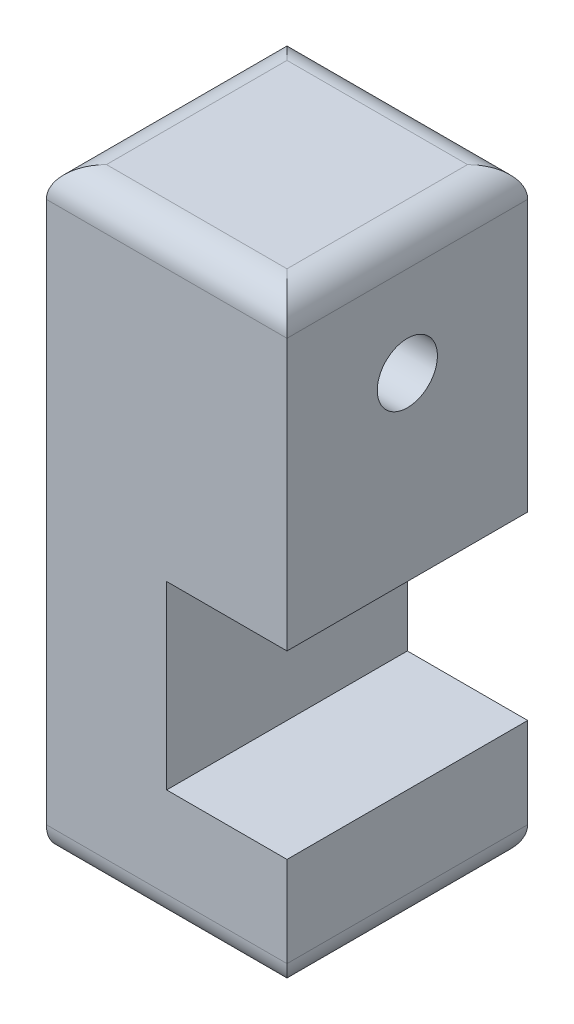
ISO-10303-21;
HEADER;
FILE_DESCRIPTION(('STEP AP214'),'2;1');
FILE_NAME('part.step','',(''),(''),'','','');
FILE_SCHEMA(('AUTOMOTIVE_DESIGN { 1 0 10303 214 1 1 1 1 }'));
ENDSEC;
DATA;
#1=APPLICATION_CONTEXT('core data for automotive mechanical design processes');
#2=APPLICATION_PROTOCOL_DEFINITION('international standard','automotive_design',2000,#1);
#3=PRODUCT_CONTEXT('',#1,'mechanical');
#4=PRODUCT('Part','Part','',(#3));
#5=PRODUCT_RELATED_PRODUCT_CATEGORY('part','',(#4));
#6=PRODUCT_DEFINITION_FORMATION('','',#4);
#7=PRODUCT_DEFINITION_CONTEXT('part definition',#1,'design');
#8=PRODUCT_DEFINITION('design','',#6,#7);
#9=PRODUCT_DEFINITION_SHAPE('','',#8);
#10=(LENGTH_UNIT() NAMED_UNIT(*) SI_UNIT(.MILLI.,.METRE.));
#11=(NAMED_UNIT(*) PLANE_ANGLE_UNIT() SI_UNIT($,.RADIAN.));
#12=(NAMED_UNIT(*) SI_UNIT($,.STERADIAN.) SOLID_ANGLE_UNIT());
#13=UNCERTAINTY_MEASURE_WITH_UNIT(LENGTH_MEASURE(1.E-05),#10,'distance_accuracy_value','');
#14=(GEOMETRIC_REPRESENTATION_CONTEXT(3) GLOBAL_UNCERTAINTY_ASSIGNED_CONTEXT((#13)) GLOBAL_UNIT_ASSIGNED_CONTEXT((#10,
#11,#12)) REPRESENTATION_CONTEXT('',''));
#15=CARTESIAN_POINT('',(0.,0.,0.));
#16=DIRECTION('',(0.,0.,1.));
#17=DIRECTION('',(1.,0.,0.));
#18=AXIS2_PLACEMENT_3D('',#15,#16,#17);
#19=CARTESIAN_POINT('',(25.4,50.8,-12.7));
#20=DIRECTION('',(-1.,0.,0.));
#21=DIRECTION('',(0.,0.,-1.));
#22=AXIS2_PLACEMENT_3D('',#19,#20,#21);
#23=CYLINDRICAL_SURFACE('',#22,3.175);
#24=CARTESIAN_POINT('',(25.4,50.8,-12.7));
#25=DIRECTION('',(-1.,0.,0.));
#26=DIRECTION('',(0.,0.,-1.));
#27=AXIS2_PLACEMENT_3D('',#24,#25,#26);
#28=CIRCLE('',#27,3.175);
#29=CARTESIAN_POINT('',(25.4,50.8,-9.525));
#30=VERTEX_POINT('',#29);
#31=EDGE_CURVE('E26',#30,#30,#28,.T.);
#32=ORIENTED_EDGE('',*,*,#31,.F.);
#33=DIRECTION('',(-1.,0.,0.));
#34=VECTOR('',#33,1.);
#35=CARTESIAN_POINT('',(25.4,50.8,-9.525));
#36=LINE('',#35,#34);
#37=CARTESIAN_POINT('',(0.,50.8,-9.525));
#38=VERTEX_POINT('',#37);
#39=EDGE_CURVE('E10',#30,#38,#36,.T.);
#40=ORIENTED_EDGE('',*,*,#39,.T.);
#41=CARTESIAN_POINT('',(0.,50.8,-12.7));
#42=DIRECTION('',(1.,0.,0.));
#43=DIRECTION('',(0.,0.,-1.));
#44=AXIS2_PLACEMENT_3D('',#41,#42,#43);
#45=CIRCLE('',#44,3.175);
#46=EDGE_CURVE('E233',#38,#38,#45,.T.);
#47=ORIENTED_EDGE('',*,*,#46,.F.);
#48=ORIENTED_EDGE('',*,*,#39,.F.);
#49=EDGE_LOOP('',(#32,#40,#47,#48));
#50=FACE_BOUND('',#49,.T.);
#51=ADVANCED_FACE('F15',(#50),#23,.F.);
#52=CARTESIAN_POINT('',(0.,0.,-25.4));
#53=DIRECTION('',(0.,0.,-1.));
#54=DIRECTION('',(0.,-1.,0.));
#55=AXIS2_PLACEMENT_3D('',#52,#53,#54);
#56=PLANE('',#55);
#57=DIRECTION('',(1.,0.,0.));
#58=VECTOR('',#57,1.);
#59=CARTESIAN_POINT('',(0.,3.175,-25.4));
#60=LINE('',#59,#58);
#61=CARTESIAN_POINT('',(0.,3.175,-25.4));
#62=VERTEX_POINT('',#61);
#63=CARTESIAN_POINT('',(25.4,3.175,-25.4));
#64=VERTEX_POINT('',#63);
#65=EDGE_CURVE('E226',#62,#64,#60,.T.);
#66=ORIENTED_EDGE('',*,*,#65,.F.);
#67=DIRECTION('',(0.,1.,0.));
#68=VECTOR('',#67,1.);
#69=CARTESIAN_POINT('',(0.,0.,-25.4));
#70=LINE('',#69,#68);
#71=CARTESIAN_POINT('',(0.,60.325,-25.4));
#72=VERTEX_POINT('',#71);
#73=EDGE_CURVE('E237',#62,#72,#70,.T.);
#74=ORIENTED_EDGE('',*,*,#73,.T.);
#75=DIRECTION('',(-1.,0.,0.));
#76=VECTOR('',#75,1.);
#77=CARTESIAN_POINT('',(0.,60.325,-25.4));
#78=LINE('',#77,#76);
#79=CARTESIAN_POINT('',(25.4,60.325,-25.4));
#80=VERTEX_POINT('',#79);
#81=EDGE_CURVE('E211',#80,#72,#78,.T.);
#82=ORIENTED_EDGE('',*,*,#81,.F.);
#83=DIRECTION('',(0.,1.,0.));
#84=VECTOR('',#83,1.);
#85=CARTESIAN_POINT('',(25.4,0.,-25.4));
#86=LINE('',#85,#84);
#87=CARTESIAN_POINT('',(25.4,31.75,-25.4));
#88=VERTEX_POINT('',#87);
#89=EDGE_CURVE('E174',#88,#80,#86,.T.);
#90=ORIENTED_EDGE('',*,*,#89,.F.);
#91=DIRECTION('',(-1.,0.,0.));
#92=VECTOR('',#91,1.);
#93=CARTESIAN_POINT('',(12.7,31.75,-25.4));
#94=LINE('',#93,#92);
#95=CARTESIAN_POINT('',(12.7,31.75,-25.4));
#96=VERTEX_POINT('',#95);
#97=EDGE_CURVE('E188',#88,#96,#94,.T.);
#98=ORIENTED_EDGE('',*,*,#97,.T.);
#99=DIRECTION('',(0.,-1.,0.));
#100=VECTOR('',#99,1.);
#101=CARTESIAN_POINT('',(12.7,11.1125,-25.4));
#102=LINE('',#101,#100);
#103=CARTESIAN_POINT('',(12.7,12.7,-25.4));
#104=VERTEX_POINT('',#103);
#105=EDGE_CURVE('E159',#96,#104,#102,.T.);
#106=ORIENTED_EDGE('',*,*,#105,.T.);
#107=DIRECTION('',(1.,0.,0.));
#108=VECTOR('',#107,1.);
#109=CARTESIAN_POINT('',(12.7,12.7,-25.4));
#110=LINE('',#109,#108);
#111=CARTESIAN_POINT('',(25.4,12.7,-25.4));
#112=VERTEX_POINT('',#111);
#113=EDGE_CURVE('E177',#104,#112,#110,.T.);
#114=ORIENTED_EDGE('',*,*,#113,.T.);
#115=DIRECTION('',(0.,1.,0.));
#116=VECTOR('',#115,1.);
#117=CARTESIAN_POINT('',(25.4,0.,-25.4));
#118=LINE('',#117,#116);
#119=EDGE_CURVE('E165',#64,#112,#118,.T.);
#120=ORIENTED_EDGE('',*,*,#119,.F.);
#121=EDGE_LOOP('',(#66,#74,#82,#90,#98,#106,#114,#120));
#122=FACE_BOUND('',#121,.T.);
#123=ADVANCED_FACE('F178',(#122),#56,.T.);
#124=CARTESIAN_POINT('',(25.4,31.75,-12.7));
#125=DIRECTION('',(1.,0.,0.));
#126=DIRECTION('',(0.,1.,0.));
#127=AXIS2_PLACEMENT_3D('',#124,#125,#126);
#128=PLANE('',#127);
#129=ORIENTED_EDGE('',*,*,#31,.T.);
#130=EDGE_LOOP('',(#129));
#131=FACE_BOUND('',#130,.T.);
#132=DIRECTION('',(0.,0.,-1.));
#133=VECTOR('',#132,1.);
#134=CARTESIAN_POINT('',(25.4,60.325,-19.05));
#135=LINE('',#134,#133);
#136=CARTESIAN_POINT('',(25.4,60.325,0.));
#137=VERTEX_POINT('',#136);
#138=EDGE_CURVE('E240',#137,#80,#135,.T.);
#139=ORIENTED_EDGE('',*,*,#138,.F.);
#140=DIRECTION('',(0.,-1.,0.));
#141=VECTOR('',#140,1.);
#142=CARTESIAN_POINT('',(25.4,63.5,0.));
#143=LINE('',#142,#141);
#144=CARTESIAN_POINT('',(25.4,31.75,0.));
#145=VERTEX_POINT('',#144);
#146=EDGE_CURVE('E252',#137,#145,#143,.T.);
#147=ORIENTED_EDGE('',*,*,#146,.T.);
#148=DIRECTION('',(0.,0.,-1.));
#149=VECTOR('',#148,1.);
#150=CARTESIAN_POINT('',(25.4,31.75,-6.35));
#151=LINE('',#150,#149);
#152=EDGE_CURVE('E236',#145,#88,#151,.T.);
#153=ORIENTED_EDGE('',*,*,#152,.T.);
#154=ORIENTED_EDGE('',*,*,#89,.T.);
#155=EDGE_LOOP('',(#139,#147,#153,#154));
#156=FACE_BOUND('',#155,.T.);
#157=ADVANCED_FACE('F360',(#131,#156),#128,.T.);
#158=CARTESIAN_POINT('',(25.4,31.75,-12.7));
#159=DIRECTION('',(1.,0.,0.));
#160=DIRECTION('',(0.,1.,0.));
#161=AXIS2_PLACEMENT_3D('',#158,#159,#160);
#162=PLANE('',#161);
#163=DIRECTION('',(0.,0.,1.));
#164=VECTOR('',#163,1.);
#165=CARTESIAN_POINT('',(25.4,3.175,-6.35));
#166=LINE('',#165,#164);
#167=CARTESIAN_POINT('',(25.4,3.175,0.));
#168=VERTEX_POINT('',#167);
#169=EDGE_CURVE('E169',#64,#168,#166,.T.);
#170=ORIENTED_EDGE('',*,*,#169,.F.);
#171=ORIENTED_EDGE('',*,*,#119,.T.);
#172=DIRECTION('',(0.,0.,1.));
#173=VECTOR('',#172,1.);
#174=CARTESIAN_POINT('',(25.4,12.7,-19.05));
#175=LINE('',#174,#173);
#176=CARTESIAN_POINT('',(25.4,12.7,0.));
#177=VERTEX_POINT('',#176);
#178=EDGE_CURVE('E121',#112,#177,#175,.T.);
#179=ORIENTED_EDGE('',*,*,#178,.T.);
#180=DIRECTION('',(0.,-1.,0.));
#181=VECTOR('',#180,1.);
#182=CARTESIAN_POINT('',(25.4,63.5,0.));
#183=LINE('',#182,#181);
#184=EDGE_CURVE('E247',#177,#168,#183,.T.);
#185=ORIENTED_EDGE('',*,*,#184,.T.);
#186=EDGE_LOOP('',(#170,#171,#179,#185));
#187=FACE_BOUND('',#186,.T.);
#188=ADVANCED_FACE('F167',(#187),#162,.T.);
#189=CARTESIAN_POINT('',(12.7,22.225,-12.7));
#190=DIRECTION('',(-1.,0.,0.));
#191=DIRECTION('',(0.,0.,1.));
#192=AXIS2_PLACEMENT_3D('',#189,#190,#191);
#193=PLANE('',#192);
#194=CARTESIAN_POINT('',(12.7,22.225,-12.7));
#195=DIRECTION('',(-1.,0.,0.));
#196=DIRECTION('',(0.,0.,-1.));
#197=AXIS2_PLACEMENT_3D('',#194,#195,#196);
#198=CIRCLE('',#197,2.0828);
#199=CARTESIAN_POINT('',(12.7,22.225,-10.6172));
#200=VERTEX_POINT('',#199);
#201=EDGE_CURVE('E216',#200,#200,#198,.T.);
#202=ORIENTED_EDGE('',*,*,#201,.T.);
#203=EDGE_LOOP('',(#202));
#204=FACE_BOUND('',#203,.T.);
#205=ORIENTED_EDGE('',*,*,#105,.F.);
#206=DIRECTION('',(0.,0.,-1.));
#207=VECTOR('',#206,1.);
#208=CARTESIAN_POINT('',(12.7,31.75,-25.4));
#209=LINE('',#208,#207);
#210=CARTESIAN_POINT('',(12.7,31.75,0.));
#211=VERTEX_POINT('',#210);
#212=EDGE_CURVE('E194',#211,#96,#209,.T.);
#213=ORIENTED_EDGE('',*,*,#212,.F.);
#214=DIRECTION('',(0.,1.,0.));
#215=VECTOR('',#214,1.);
#216=CARTESIAN_POINT('',(12.7,42.8625,0.));
#217=LINE('',#216,#215);
#218=CARTESIAN_POINT('',(12.7,12.7,0.));
#219=VERTEX_POINT('',#218);
#220=EDGE_CURVE('E253',#219,#211,#217,.T.);
#221=ORIENTED_EDGE('',*,*,#220,.F.);
#222=DIRECTION('',(0.,0.,1.));
#223=VECTOR('',#222,1.);
#224=CARTESIAN_POINT('',(12.7,12.7,0.));
#225=LINE('',#224,#223);
#226=EDGE_CURVE('E181',#104,#219,#225,.T.);
#227=ORIENTED_EDGE('',*,*,#226,.F.);
#228=EDGE_LOOP('',(#205,#213,#221,#227));
#229=FACE_BOUND('',#228,.T.);
#230=ADVANCED_FACE('F380',(#204,#229),#193,.F.);
#231=CARTESIAN_POINT('',(25.4,12.7,-25.4));
#232=DIRECTION('',(0.,-1.,0.));
#233=DIRECTION('',(0.,0.,-1.));
#234=AXIS2_PLACEMENT_3D('',#231,#232,#233);
#235=PLANE('',#234);
#236=ORIENTED_EDGE('',*,*,#178,.F.);
#237=ORIENTED_EDGE('',*,*,#113,.F.);
#238=ORIENTED_EDGE('',*,*,#226,.T.);
#239=DIRECTION('',(-1.,0.,0.));
#240=VECTOR('',#239,1.);
#241=CARTESIAN_POINT('',(12.7,12.7,0.));
#242=LINE('',#241,#240);
#243=EDGE_CURVE('E185',#177,#219,#242,.T.);
#244=ORIENTED_EDGE('',*,*,#243,.F.);
#245=EDGE_LOOP('',(#236,#237,#238,#244));
#246=FACE_BOUND('',#245,.T.);
#247=ADVANCED_FACE('F183',(#246),#235,.F.);
#248=CARTESIAN_POINT('',(25.4,31.75,0.));
#249=DIRECTION('',(0.,1.,0.));
#250=DIRECTION('',(1.,0.,0.));
#251=AXIS2_PLACEMENT_3D('',#248,#249,#250);
#252=PLANE('',#251);
#253=ORIENTED_EDGE('',*,*,#152,.F.);
#254=DIRECTION('',(1.,0.,0.));
#255=VECTOR('',#254,1.);
#256=CARTESIAN_POINT('',(12.7,31.75,0.));
#257=LINE('',#256,#255);
#258=EDGE_CURVE('E248',#211,#145,#257,.T.);
#259=ORIENTED_EDGE('',*,*,#258,.F.);
#260=ORIENTED_EDGE('',*,*,#212,.T.);
#261=ORIENTED_EDGE('',*,*,#97,.F.);
#262=EDGE_LOOP('',(#253,#259,#260,#261));
#263=FACE_BOUND('',#262,.T.);
#264=ADVANCED_FACE('F379',(#263),#252,.F.);
#265=CARTESIAN_POINT('',(0.,63.5,-25.4));
#266=DIRECTION('',(0.,1.,0.));
#267=DIRECTION('',(0.,0.,-1.));
#268=AXIS2_PLACEMENT_3D('',#265,#266,#267);
#269=PLANE('',#268);
#270=DIRECTION('',(0.,0.,-1.));
#271=VECTOR('',#270,1.);
#272=CARTESIAN_POINT('',(3.175,63.5,-19.05));
#273=LINE('',#272,#271);
#274=CARTESIAN_POINT('',(3.175,63.5,-3.175));
#275=VERTEX_POINT('',#274);
#276=CARTESIAN_POINT('',(3.175,63.5,-22.225));
#277=VERTEX_POINT('',#276);
#278=EDGE_CURVE('E204',#275,#277,#273,.T.);
#279=ORIENTED_EDGE('',*,*,#278,.F.);
#280=DIRECTION('',(-1.,0.,0.));
#281=VECTOR('',#280,1.);
#282=CARTESIAN_POINT('',(0.,63.5,-3.175));
#283=LINE('',#282,#281);
#284=CARTESIAN_POINT('',(22.225,63.5,-3.175));
#285=VERTEX_POINT('',#284);
#286=EDGE_CURVE('E241',#285,#275,#283,.T.);
#287=ORIENTED_EDGE('',*,*,#286,.F.);
#288=DIRECTION('',(0.,0.,1.));
#289=VECTOR('',#288,1.);
#290=CARTESIAN_POINT('',(22.225,63.5,-19.05));
#291=LINE('',#290,#289);
#292=CARTESIAN_POINT('',(22.225,63.5,-22.225));
#293=VERTEX_POINT('',#292);
#294=EDGE_CURVE('E145',#293,#285,#291,.T.);
#295=ORIENTED_EDGE('',*,*,#294,.F.);
#296=DIRECTION('',(1.,0.,0.));
#297=VECTOR('',#296,1.);
#298=CARTESIAN_POINT('',(0.,63.5,-22.225));
#299=LINE('',#298,#297);
#300=EDGE_CURVE('E206',#277,#293,#299,.T.);
#301=ORIENTED_EDGE('',*,*,#300,.F.);
#302=EDGE_LOOP('',(#279,#287,#295,#301));
#303=FACE_BOUND('',#302,.T.);
#304=ADVANCED_FACE('F457',(#303),#269,.T.);
#305=CARTESIAN_POINT('',(0.,31.75,-12.7));
#306=DIRECTION('',(1.,0.,0.));
#307=DIRECTION('',(0.,1.,0.));
#308=AXIS2_PLACEMENT_3D('',#305,#306,#307);
#309=PLANE('',#308);
#310=ORIENTED_EDGE('',*,*,#46,.T.);
#311=EDGE_LOOP('',(#310));
#312=FACE_BOUND('',#311,.T.);
#313=CARTESIAN_POINT('',(0.,22.225,-12.7));
#314=DIRECTION('',(1.,0.,0.));
#315=DIRECTION('',(0.,0.,-1.));
#316=AXIS2_PLACEMENT_3D('',#313,#314,#315);
#317=CIRCLE('',#316,2.0828);
#318=CARTESIAN_POINT('',(0.,22.225,-10.6172));
#319=VERTEX_POINT('',#318);
#320=EDGE_CURVE('E232',#319,#319,#317,.T.);
#321=ORIENTED_EDGE('',*,*,#320,.T.);
#322=EDGE_LOOP('',(#321));
#323=FACE_BOUND('',#322,.T.);
#324=CARTESIAN_POINT('',(0.,3.175,-22.225));
#325=DIRECTION('',(1.,0.,0.));
#326=DIRECTION('',(0.,-0.707106781186548,-0.707106781186547));
#327=AXIS2_PLACEMENT_3D('',#324,#325,#326);
#328=CIRCLE('',#327,3.175);
#329=CARTESIAN_POINT('',(0.,0.,-22.225));
#330=VERTEX_POINT('',#329);
#331=EDGE_CURVE('E231',#330,#62,#328,.T.);
#332=ORIENTED_EDGE('',*,*,#331,.F.);
#333=DIRECTION('',(0.,0.,-1.));
#334=VECTOR('',#333,1.);
#335=CARTESIAN_POINT('',(0.,0.,0.));
#336=LINE('',#335,#334);
#337=CARTESIAN_POINT('',(0.,0.,-3.175));
#338=VERTEX_POINT('',#337);
#339=EDGE_CURVE('E243',#338,#330,#336,.T.);
#340=ORIENTED_EDGE('',*,*,#339,.F.);
#341=CARTESIAN_POINT('',(0.,3.175,-3.175));
#342=DIRECTION('',(1.,0.,0.));
#343=DIRECTION('',(0.,-0.707106781186547,0.707106781186548));
#344=AXIS2_PLACEMENT_3D('',#341,#342,#343);
#345=CIRCLE('',#344,3.175);
#346=CARTESIAN_POINT('',(0.,3.175,0.));
#347=VERTEX_POINT('',#346);
#348=EDGE_CURVE('E258',#347,#338,#345,.T.);
#349=ORIENTED_EDGE('',*,*,#348,.F.);
#350=DIRECTION('',(0.,-1.,0.));
#351=VECTOR('',#350,1.);
#352=CARTESIAN_POINT('',(0.,63.5,0.));
#353=LINE('',#352,#351);
#354=CARTESIAN_POINT('',(0.,60.325,0.));
#355=VERTEX_POINT('',#354);
#356=EDGE_CURVE('E200',#355,#347,#353,.T.);
#357=ORIENTED_EDGE('',*,*,#356,.F.);
#358=DIRECTION('',(0.,0.,1.));
#359=VECTOR('',#358,1.);
#360=CARTESIAN_POINT('',(0.,60.325,-19.05));
#361=LINE('',#360,#359);
#362=EDGE_CURVE('E19',#72,#355,#361,.T.);
#363=ORIENTED_EDGE('',*,*,#362,.F.);
#364=ORIENTED_EDGE('',*,*,#73,.F.);
#365=EDGE_LOOP('',(#332,#340,#349,#357,#363,#364));
#366=FACE_BOUND('',#365,.T.);
#367=ADVANCED_FACE('F17',(#312,#323,#366),#309,.F.);
#368=CARTESIAN_POINT('',(22.225,60.325,-19.05));
#369=DIRECTION('',(0.,0.,1.));
#370=DIRECTION('',(0.707106781186549,0.707106781186547,0.));
#371=AXIS2_PLACEMENT_3D('',#368,#369,#370);
#372=CYLINDRICAL_SURFACE('',#371,3.175);
#373=ORIENTED_EDGE('',*,*,#138,.T.);
#374=CARTESIAN_POINT('',(22.225,60.325,-22.225));
#375=DIRECTION('',(-0.707106781186548,0.,-0.707106781186548));
#376=DIRECTION('',(-0.707106781186548,0.,0.707106781186548));
#377=AXIS2_PLACEMENT_3D('',#374,#375,#376);
#378=ELLIPSE('',#377,4.49012806053458,3.175);
#379=EDGE_CURVE('E210',#293,#80,#378,.T.);
#380=ORIENTED_EDGE('',*,*,#379,.F.);
#381=ORIENTED_EDGE('',*,*,#294,.T.);
#382=CARTESIAN_POINT('',(22.225,60.325,-3.175));
#383=DIRECTION('',(-0.707106781186548,0.,0.707106781186548));
#384=DIRECTION('',(-0.707106781186548,0.,-0.707106781186548));
#385=AXIS2_PLACEMENT_3D('',#382,#383,#384);
#386=ELLIPSE('',#385,4.49012806053458,3.175);
#387=EDGE_CURVE('E238',#137,#285,#386,.T.);
#388=ORIENTED_EDGE('',*,*,#387,.F.);
#389=EDGE_LOOP('',(#373,#380,#381,#388));
#390=FACE_BOUND('',#389,.T.);
#391=ADVANCED_FACE('F476',(#390),#372,.T.);
#392=CARTESIAN_POINT('',(0.,60.325,-3.175));
#393=DIRECTION('',(1.,0.,0.));
#394=DIRECTION('',(0.,0.707106781186546,0.707106781186549));
#395=AXIS2_PLACEMENT_3D('',#392,#393,#394);
#396=CYLINDRICAL_SURFACE('',#395,3.175);
#397=ORIENTED_EDGE('',*,*,#286,.T.);
#398=CARTESIAN_POINT('',(3.175,60.325,-3.175));
#399=DIRECTION('',(-0.707106781186547,0.,-0.707106781186548));
#400=DIRECTION('',(0.707106781186548,0.,-0.707106781186547));
#401=AXIS2_PLACEMENT_3D('',#398,#399,#400);
#402=ELLIPSE('',#401,4.49012806053458,3.175);
#403=EDGE_CURVE('E254',#355,#275,#402,.T.);
#404=ORIENTED_EDGE('',*,*,#403,.F.);
#405=DIRECTION('',(1.,0.,0.));
#406=VECTOR('',#405,1.);
#407=CARTESIAN_POINT('',(0.,60.325,0.));
#408=LINE('',#407,#406);
#409=EDGE_CURVE('E205',#355,#137,#408,.T.);
#410=ORIENTED_EDGE('',*,*,#409,.T.);
#411=ORIENTED_EDGE('',*,*,#387,.T.);
#412=EDGE_LOOP('',(#397,#404,#410,#411));
#413=FACE_BOUND('',#412,.T.);
#414=ADVANCED_FACE('F368',(#413),#396,.T.);
#415=CARTESIAN_POINT('',(0.,60.325,-22.225));
#416=DIRECTION('',(1.,0.,0.));
#417=DIRECTION('',(0.,0.707106781186547,-0.707106781186549));
#418=AXIS2_PLACEMENT_3D('',#415,#416,#417);
#419=CYLINDRICAL_SURFACE('',#418,3.175);
#420=ORIENTED_EDGE('',*,*,#81,.T.);
#421=CARTESIAN_POINT('',(3.175,60.325,-22.225));
#422=DIRECTION('',(-0.707106781186547,0.,0.707106781186548));
#423=DIRECTION('',(-0.707106781186548,0.,-0.707106781186547));
#424=AXIS2_PLACEMENT_3D('',#421,#422,#423);
#425=ELLIPSE('',#424,4.49012806053458,3.175);
#426=EDGE_CURVE('E212',#277,#72,#425,.T.);
#427=ORIENTED_EDGE('',*,*,#426,.F.);
#428=ORIENTED_EDGE('',*,*,#300,.T.);
#429=ORIENTED_EDGE('',*,*,#379,.T.);
#430=EDGE_LOOP('',(#420,#427,#428,#429));
#431=FACE_BOUND('',#430,.T.);
#432=ADVANCED_FACE('F364',(#431),#419,.T.);
#433=CARTESIAN_POINT('',(3.175,60.325,-19.05));
#434=DIRECTION('',(0.,0.,1.));
#435=DIRECTION('',(-0.707106781186549,0.707106781186546,0.));
#436=AXIS2_PLACEMENT_3D('',#433,#434,#435);
#437=CYLINDRICAL_SURFACE('',#436,3.175);
#438=ORIENTED_EDGE('',*,*,#278,.T.);
#439=ORIENTED_EDGE('',*,*,#426,.T.);
#440=ORIENTED_EDGE('',*,*,#362,.T.);
#441=ORIENTED_EDGE('',*,*,#403,.T.);
#442=EDGE_LOOP('',(#438,#439,#440,#441));
#443=FACE_BOUND('',#442,.T.);
#444=ADVANCED_FACE('F367',(#443),#437,.T.);
#445=CARTESIAN_POINT('',(0.,63.5,0.));
#446=DIRECTION('',(0.,0.,1.));
#447=DIRECTION('',(0.,-1.,0.));
#448=AXIS2_PLACEMENT_3D('',#445,#446,#447);
#449=PLANE('',#448);
#450=DIRECTION('',(-1.,0.,0.));
#451=VECTOR('',#450,1.);
#452=CARTESIAN_POINT('',(0.,3.175,0.));
#453=LINE('',#452,#451);
#454=EDGE_CURVE('E225',#168,#347,#453,.T.);
#455=ORIENTED_EDGE('',*,*,#454,.F.);
#456=ORIENTED_EDGE('',*,*,#184,.F.);
#457=ORIENTED_EDGE('',*,*,#243,.T.);
#458=ORIENTED_EDGE('',*,*,#220,.T.);
#459=ORIENTED_EDGE('',*,*,#258,.T.);
#460=ORIENTED_EDGE('',*,*,#146,.F.);
#461=ORIENTED_EDGE('',*,*,#409,.F.);
#462=ORIENTED_EDGE('',*,*,#356,.T.);
#463=EDGE_LOOP('',(#455,#456,#457,#458,#459,#460,#461,#462));
#464=FACE_BOUND('',#463,.T.);
#465=ADVANCED_FACE('F351',(#464),#449,.T.);
#466=CARTESIAN_POINT('',(0.,0.,0.));
#467=DIRECTION('',(0.,-1.,0.));
#468=DIRECTION('',(0.,0.,-1.));
#469=AXIS2_PLACEMENT_3D('',#466,#467,#468);
#470=PLANE('',#469);
#471=DIRECTION('',(-1.,0.,0.));
#472=VECTOR('',#471,1.);
#473=CARTESIAN_POINT('',(0.,0.,-22.225));
#474=LINE('',#473,#472);
#475=CARTESIAN_POINT('',(22.225,0.,-22.225));
#476=VERTEX_POINT('',#475);
#477=EDGE_CURVE('E227',#476,#330,#474,.T.);
#478=ORIENTED_EDGE('',*,*,#477,.F.);
#479=DIRECTION('',(0.,0.,-1.));
#480=VECTOR('',#479,1.);
#481=CARTESIAN_POINT('',(22.225,0.,-6.35));
#482=LINE('',#481,#480);
#483=CARTESIAN_POINT('',(22.225,0.,-3.175));
#484=VERTEX_POINT('',#483);
#485=EDGE_CURVE('E132',#484,#476,#482,.T.);
#486=ORIENTED_EDGE('',*,*,#485,.F.);
#487=DIRECTION('',(1.,0.,0.));
#488=VECTOR('',#487,1.);
#489=CARTESIAN_POINT('',(0.,0.,-3.175));
#490=LINE('',#489,#488);
#491=EDGE_CURVE('E198',#338,#484,#490,.T.);
#492=ORIENTED_EDGE('',*,*,#491,.F.);
#493=ORIENTED_EDGE('',*,*,#339,.T.);
#494=EDGE_LOOP('',(#478,#486,#492,#493));
#495=FACE_BOUND('',#494,.T.);
#496=ADVANCED_FACE('F334',(#495),#470,.T.);
#497=CARTESIAN_POINT('',(22.225,3.175,-6.35));
#498=DIRECTION('',(0.,0.,-1.));
#499=DIRECTION('',(0.707106781186547,-0.707106781186548,0.));
#500=AXIS2_PLACEMENT_3D('',#497,#498,#499);
#501=CYLINDRICAL_SURFACE('',#500,3.175);
#502=ORIENTED_EDGE('',*,*,#169,.T.);
#503=CARTESIAN_POINT('',(22.225,3.175,-3.175));
#504=DIRECTION('',(-0.707106781186548,0.,0.707106781186547));
#505=DIRECTION('',(-0.707106781186547,0.,-0.707106781186548));
#506=AXIS2_PLACEMENT_3D('',#503,#504,#505);
#507=ELLIPSE('',#506,4.49012806053458,3.175);
#508=EDGE_CURVE('E282',#484,#168,#507,.T.);
#509=ORIENTED_EDGE('',*,*,#508,.F.);
#510=ORIENTED_EDGE('',*,*,#485,.T.);
#511=CARTESIAN_POINT('',(22.225,3.175,-22.225));
#512=DIRECTION('',(-0.707106781186548,0.,-0.707106781186548));
#513=DIRECTION('',(-0.707106781186548,0.,0.707106781186548));
#514=AXIS2_PLACEMENT_3D('',#511,#512,#513);
#515=ELLIPSE('',#514,4.49012806053458,3.175);
#516=EDGE_CURVE('E221',#64,#476,#515,.T.);
#517=ORIENTED_EDGE('',*,*,#516,.F.);
#518=EDGE_LOOP('',(#502,#509,#510,#517));
#519=FACE_BOUND('',#518,.T.);
#520=ADVANCED_FACE('F343',(#519),#501,.T.);
#521=CARTESIAN_POINT('',(0.,3.175,-3.175));
#522=DIRECTION('',(1.,0.,0.));
#523=DIRECTION('',(0.,-0.707106781186547,0.707106781186548));
#524=AXIS2_PLACEMENT_3D('',#521,#522,#523);
#525=CYLINDRICAL_SURFACE('',#524,3.175);
#526=ORIENTED_EDGE('',*,*,#454,.T.);
#527=ORIENTED_EDGE('',*,*,#348,.T.);
#528=ORIENTED_EDGE('',*,*,#491,.T.);
#529=ORIENTED_EDGE('',*,*,#508,.T.);
#530=EDGE_LOOP('',(#526,#527,#528,#529));
#531=FACE_BOUND('',#530,.T.);
#532=ADVANCED_FACE('F332',(#531),#525,.T.);
#533=CARTESIAN_POINT('',(0.,3.175,-22.225));
#534=DIRECTION('',(1.,0.,0.));
#535=DIRECTION('',(0.,-0.707106781186548,-0.707106781186547));
#536=AXIS2_PLACEMENT_3D('',#533,#534,#535);
#537=CYLINDRICAL_SURFACE('',#536,3.175);
#538=ORIENTED_EDGE('',*,*,#477,.T.);
#539=ORIENTED_EDGE('',*,*,#331,.T.);
#540=ORIENTED_EDGE('',*,*,#65,.T.);
#541=ORIENTED_EDGE('',*,*,#516,.T.);
#542=EDGE_LOOP('',(#538,#539,#540,#541));
#543=FACE_BOUND('',#542,.T.);
#544=ADVANCED_FACE('F341',(#543),#537,.T.);
#545=CARTESIAN_POINT('',(12.7,22.225,-12.7));
#546=DIRECTION('',(-1.,0.,0.));
#547=DIRECTION('',(0.,0.,-1.));
#548=AXIS2_PLACEMENT_3D('',#545,#546,#547);
#549=CYLINDRICAL_SURFACE('',#548,2.0828);
#550=ORIENTED_EDGE('',*,*,#201,.F.);
#551=DIRECTION('',(-1.,0.,0.));
#552=VECTOR('',#551,1.);
#553=CARTESIAN_POINT('',(12.7,22.225,-10.6172));
#554=LINE('',#553,#552);
#555=EDGE_CURVE('E220',#200,#319,#554,.T.);
#556=ORIENTED_EDGE('',*,*,#555,.T.);
#557=ORIENTED_EDGE('',*,*,#320,.F.);
#558=ORIENTED_EDGE('',*,*,#555,.F.);
#559=EDGE_LOOP('',(#550,#556,#557,#558));
#560=FACE_BOUND('',#559,.T.);
#561=ADVANCED_FACE('F370',(#560),#549,.F.);
#562=CLOSED_SHELL('',(#51,#123,#157,#188,#230,#247,#264,#304,#367,#391,#414,#432,#444,#465,#496,
#520,#532,#544,#561));
#563=MANIFOLD_SOLID_BREP('B1',#562);
#564=ADVANCED_BREP_SHAPE_REPRESENTATION('',(#18,#563),#14);
#565=SHAPE_DEFINITION_REPRESENTATION(#9,#564);
ENDSEC;
END-ISO-10303-21;
